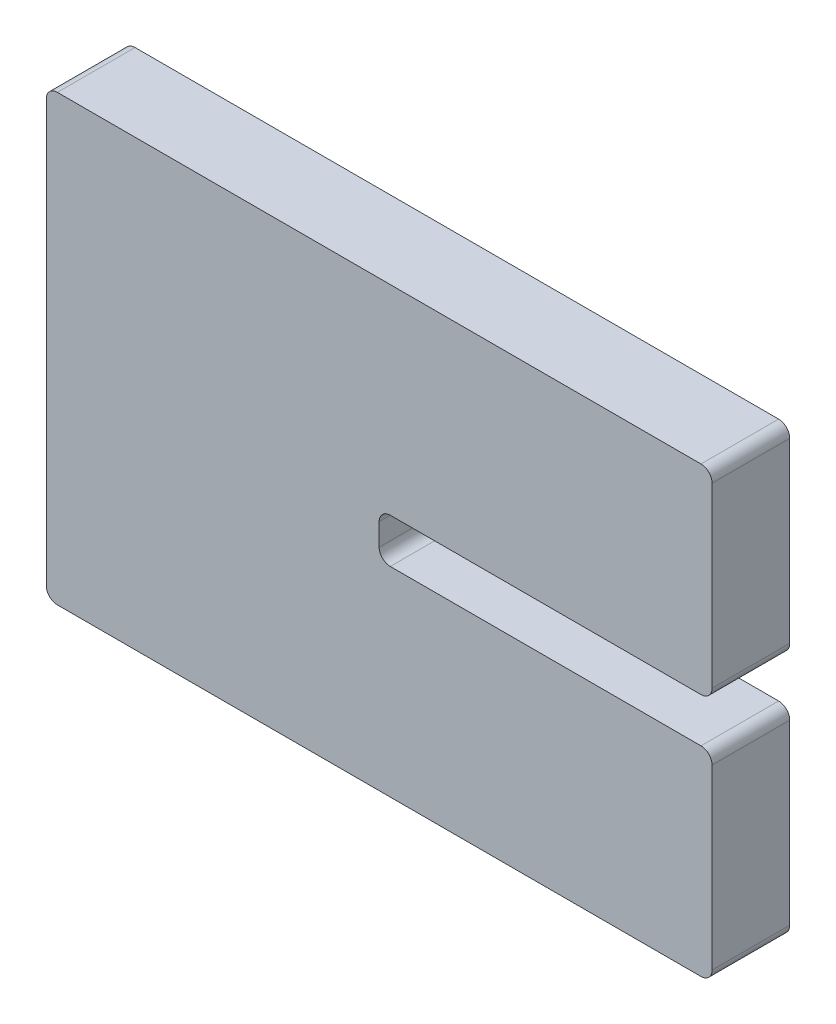
ISO-10303-21;
HEADER;
FILE_DESCRIPTION(('STEP AP214'),'2;1');
FILE_NAME('part.step','',(''),(''),'','','');
FILE_SCHEMA(('AUTOMOTIVE_DESIGN { 1 0 10303 214 1 1 1 1 }'));
ENDSEC;
DATA;
#1=APPLICATION_CONTEXT('core data for automotive mechanical design processes');
#2=APPLICATION_PROTOCOL_DEFINITION('international standard','automotive_design',2000,#1);
#3=PRODUCT_CONTEXT('',#1,'mechanical');
#4=PRODUCT('Part','Part','',(#3));
#5=PRODUCT_RELATED_PRODUCT_CATEGORY('part','',(#4));
#6=PRODUCT_DEFINITION_FORMATION('','',#4);
#7=PRODUCT_DEFINITION_CONTEXT('part definition',#1,'design');
#8=PRODUCT_DEFINITION('design','',#6,#7);
#9=PRODUCT_DEFINITION_SHAPE('','',#8);
#10=(LENGTH_UNIT() NAMED_UNIT(*) SI_UNIT(.MILLI.,.METRE.));
#11=(NAMED_UNIT(*) PLANE_ANGLE_UNIT() SI_UNIT($,.RADIAN.));
#12=(NAMED_UNIT(*) SI_UNIT($,.STERADIAN.) SOLID_ANGLE_UNIT());
#13=UNCERTAINTY_MEASURE_WITH_UNIT(LENGTH_MEASURE(1.E-05),#10,'distance_accuracy_value','');
#14=(GEOMETRIC_REPRESENTATION_CONTEXT(3) GLOBAL_UNCERTAINTY_ASSIGNED_CONTEXT((#13)) GLOBAL_UNIT_ASSIGNED_CONTEXT((#10,
#11,#12)) REPRESENTATION_CONTEXT('',''));
#15=CARTESIAN_POINT('',(0.,0.,0.));
#16=DIRECTION('',(0.,0.,1.));
#17=DIRECTION('',(1.,0.,0.));
#18=AXIS2_PLACEMENT_3D('',#15,#16,#17);
#19=CARTESIAN_POINT('',(-15.,-10.,3.5));
#20=DIRECTION('',(0.,1.,0.));
#21=DIRECTION('',(0.,0.,1.));
#22=AXIS2_PLACEMENT_3D('',#19,#20,#21);
#23=PLANE('',#22);
#24=DIRECTION('',(1.,0.,0.));
#25=VECTOR('',#24,1.);
#26=CARTESIAN_POINT('',(-15.,-10.,0.));
#27=LINE('',#26,#25);
#28=CARTESIAN_POINT('',(-14.5,-10.,0.));
#29=VERTEX_POINT('',#28);
#30=CARTESIAN_POINT('',(14.5,-10.,0.));
#31=VERTEX_POINT('',#30);
#32=EDGE_CURVE('E272',#29,#31,#27,.T.);
#33=ORIENTED_EDGE('',*,*,#32,.T.);
#34=DIRECTION('',(0.,0.,-1.));
#35=VECTOR('',#34,1.);
#36=CARTESIAN_POINT('',(14.5,-10.,3.5));
#37=LINE('',#36,#35);
#38=CARTESIAN_POINT('',(14.5,-10.,3.5));
#39=VERTEX_POINT('',#38);
#40=EDGE_CURVE('E242',#31,#39,#37,.F.);
#41=ORIENTED_EDGE('',*,*,#40,.T.);
#42=DIRECTION('',(1.,0.,0.));
#43=VECTOR('',#42,1.);
#44=CARTESIAN_POINT('',(-15.,-10.,3.5));
#45=LINE('',#44,#43);
#46=CARTESIAN_POINT('',(-14.5,-10.,3.5));
#47=VERTEX_POINT('',#46);
#48=EDGE_CURVE('E190',#47,#39,#45,.T.);
#49=ORIENTED_EDGE('',*,*,#48,.F.);
#50=DIRECTION('',(0.,0.,-1.));
#51=VECTOR('',#50,1.);
#52=CARTESIAN_POINT('',(-14.5,-10.,3.5));
#53=LINE('',#52,#51);
#54=EDGE_CURVE('E239',#47,#29,#53,.T.);
#55=ORIENTED_EDGE('',*,*,#54,.T.);
#56=EDGE_LOOP('',(#33,#41,#49,#55));
#57=FACE_BOUND('',#56,.T.);
#58=ADVANCED_FACE('F33',(#57),#23,.F.);
#59=CARTESIAN_POINT('',(15.,-1.,3.5));
#60=DIRECTION('',(-1.,0.,0.));
#61=DIRECTION('',(0.,0.,1.));
#62=AXIS2_PLACEMENT_3D('',#59,#60,#61);
#63=PLANE('',#62);
#64=DIRECTION('',(0.,1.,0.));
#65=VECTOR('',#64,1.);
#66=CARTESIAN_POINT('',(15.,-1.,0.));
#67=LINE('',#66,#65);
#68=CARTESIAN_POINT('',(15.,-9.5,0.));
#69=VERTEX_POINT('',#68);
#70=CARTESIAN_POINT('',(15.,-1.5,0.));
#71=VERTEX_POINT('',#70);
#72=EDGE_CURVE('E179',#69,#71,#67,.T.);
#73=ORIENTED_EDGE('',*,*,#72,.T.);
#74=DIRECTION('',(0.,0.,-1.));
#75=VECTOR('',#74,1.);
#76=CARTESIAN_POINT('',(15.,-1.5,3.5));
#77=LINE('',#76,#75);
#78=CARTESIAN_POINT('',(15.,-1.5,3.5));
#79=VERTEX_POINT('',#78);
#80=EDGE_CURVE('E237',#71,#79,#77,.F.);
#81=ORIENTED_EDGE('',*,*,#80,.T.);
#82=DIRECTION('',(0.,1.,0.));
#83=VECTOR('',#82,1.);
#84=CARTESIAN_POINT('',(15.,-1.,3.5));
#85=LINE('',#84,#83);
#86=CARTESIAN_POINT('',(15.,-9.5,3.5));
#87=VERTEX_POINT('',#86);
#88=EDGE_CURVE('E258',#87,#79,#85,.T.);
#89=ORIENTED_EDGE('',*,*,#88,.F.);
#90=DIRECTION('',(0.,0.,-1.));
#91=VECTOR('',#90,1.);
#92=CARTESIAN_POINT('',(15.,-9.5,3.5));
#93=LINE('',#92,#91);
#94=EDGE_CURVE('E234',#87,#69,#93,.T.);
#95=ORIENTED_EDGE('',*,*,#94,.T.);
#96=EDGE_LOOP('',(#73,#81,#89,#95));
#97=FACE_BOUND('',#96,.T.);
#98=ADVANCED_FACE('F278',(#97),#63,.F.);
#99=CARTESIAN_POINT('',(0.,-1.,3.5));
#100=DIRECTION('',(0.,-1.,0.));
#101=DIRECTION('',(0.,0.,-1.));
#102=AXIS2_PLACEMENT_3D('',#99,#100,#101);
#103=PLANE('',#102);
#104=DIRECTION('',(-1.,0.,0.));
#105=VECTOR('',#104,1.);
#106=CARTESIAN_POINT('',(0.,-1.,0.));
#107=LINE('',#106,#105);
#108=CARTESIAN_POINT('',(14.5,-1.,0.));
#109=VERTEX_POINT('',#108);
#110=CARTESIAN_POINT('',(0.5,-1.,0.));
#111=VERTEX_POINT('',#110);
#112=EDGE_CURVE('E174',#109,#111,#107,.T.);
#113=ORIENTED_EDGE('',*,*,#112,.T.);
#114=DIRECTION('',(0.,0.,-1.));
#115=VECTOR('',#114,1.);
#116=CARTESIAN_POINT('',(0.5,-1.,3.5));
#117=LINE('',#116,#115);
#118=CARTESIAN_POINT('',(0.5,-1.,3.5));
#119=VERTEX_POINT('',#118);
#120=EDGE_CURVE('E152',#111,#119,#117,.F.);
#121=ORIENTED_EDGE('',*,*,#120,.T.);
#122=DIRECTION('',(-1.,0.,0.));
#123=VECTOR('',#122,1.);
#124=CARTESIAN_POINT('',(0.,-1.,3.5));
#125=LINE('',#124,#123);
#126=CARTESIAN_POINT('',(14.5,-1.,3.5));
#127=VERTEX_POINT('',#126);
#128=EDGE_CURVE('E253',#127,#119,#125,.T.);
#129=ORIENTED_EDGE('',*,*,#128,.F.);
#130=DIRECTION('',(0.,0.,-1.));
#131=VECTOR('',#130,1.);
#132=CARTESIAN_POINT('',(14.5,-1.,3.5));
#133=LINE('',#132,#131);
#134=EDGE_CURVE('E167',#127,#109,#133,.T.);
#135=ORIENTED_EDGE('',*,*,#134,.T.);
#136=EDGE_LOOP('',(#113,#121,#129,#135));
#137=FACE_BOUND('',#136,.T.);
#138=ADVANCED_FACE('F283',(#137),#103,.F.);
#139=CARTESIAN_POINT('',(0.,-1.,3.5));
#140=DIRECTION('',(-1.,0.,0.));
#141=DIRECTION('',(0.,-1.,0.));
#142=AXIS2_PLACEMENT_3D('',#139,#140,#141);
#143=PLANE('',#142);
#144=DIRECTION('',(0.,1.,0.));
#145=VECTOR('',#144,1.);
#146=CARTESIAN_POINT('',(0.,-1.,3.5));
#147=LINE('',#146,#145);
#148=CARTESIAN_POINT('',(0.,-0.5,3.5));
#149=VERTEX_POINT('',#148);
#150=CARTESIAN_POINT('',(0.,0.5,3.5));
#151=VERTEX_POINT('',#150);
#152=EDGE_CURVE('E166',#149,#151,#147,.T.);
#153=ORIENTED_EDGE('',*,*,#152,.F.);
#154=DIRECTION('',(0.,0.,-1.));
#155=VECTOR('',#154,1.);
#156=CARTESIAN_POINT('',(0.,-0.5,0.));
#157=LINE('',#156,#155);
#158=CARTESIAN_POINT('',(0.,-0.5,0.));
#159=VERTEX_POINT('',#158);
#160=EDGE_CURVE('E151',#149,#159,#157,.T.);
#161=ORIENTED_EDGE('',*,*,#160,.T.);
#162=DIRECTION('',(0.,1.,0.));
#163=VECTOR('',#162,1.);
#164=CARTESIAN_POINT('',(0.,-1.,0.));
#165=LINE('',#164,#163);
#166=CARTESIAN_POINT('',(0.,0.5,0.));
#167=VERTEX_POINT('',#166);
#168=EDGE_CURVE('E163',#159,#167,#165,.T.);
#169=ORIENTED_EDGE('',*,*,#168,.T.);
#170=DIRECTION('',(0.,0.,-1.));
#171=VECTOR('',#170,1.);
#172=CARTESIAN_POINT('',(0.,0.5,3.5));
#173=LINE('',#172,#171);
#174=EDGE_CURVE('E168',#167,#151,#173,.F.);
#175=ORIENTED_EDGE('',*,*,#174,.T.);
#176=EDGE_LOOP('',(#153,#161,#169,#175));
#177=FACE_BOUND('',#176,.T.);
#178=ADVANCED_FACE('F162',(#177),#143,.F.);
#179=CARTESIAN_POINT('',(0.,1.,3.5));
#180=DIRECTION('',(0.,1.,0.));
#181=DIRECTION('',(-1.,0.,0.));
#182=AXIS2_PLACEMENT_3D('',#179,#180,#181);
#183=PLANE('',#182);
#184=DIRECTION('',(1.,0.,0.));
#185=VECTOR('',#184,1.);
#186=CARTESIAN_POINT('',(0.,1.,3.5));
#187=LINE('',#186,#185);
#188=CARTESIAN_POINT('',(0.499999999999999,1.,3.5));
#189=VERTEX_POINT('',#188);
#190=CARTESIAN_POINT('',(14.5,1.00000000000001,3.5));
#191=VERTEX_POINT('',#190);
#192=EDGE_CURVE('E260',#189,#191,#187,.T.);
#193=ORIENTED_EDGE('',*,*,#192,.F.);
#194=DIRECTION('',(0.,0.,-1.));
#195=VECTOR('',#194,1.);
#196=CARTESIAN_POINT('',(0.499999999999999,1.,0.));
#197=LINE('',#196,#195);
#198=CARTESIAN_POINT('',(0.499999999999999,1.,0.));
#199=VERTEX_POINT('',#198);
#200=EDGE_CURVE('E198',#189,#199,#197,.T.);
#201=ORIENTED_EDGE('',*,*,#200,.T.);
#202=DIRECTION('',(1.,0.,0.));
#203=VECTOR('',#202,1.);
#204=CARTESIAN_POINT('',(0.,1.,0.));
#205=LINE('',#204,#203);
#206=CARTESIAN_POINT('',(14.5,1.00000000000001,0.));
#207=VERTEX_POINT('',#206);
#208=EDGE_CURVE('E173',#199,#207,#205,.T.);
#209=ORIENTED_EDGE('',*,*,#208,.T.);
#210=DIRECTION('',(0.,0.,-1.));
#211=VECTOR('',#210,1.);
#212=CARTESIAN_POINT('',(14.5,1.00000000000001,3.5));
#213=LINE('',#212,#211);
#214=EDGE_CURVE('E196',#207,#191,#213,.F.);
#215=ORIENTED_EDGE('',*,*,#214,.T.);
#216=EDGE_LOOP('',(#193,#201,#209,#215));
#217=FACE_BOUND('',#216,.T.);
#218=ADVANCED_FACE('F290',(#217),#183,.F.);
#219=CARTESIAN_POINT('',(15.,10.,3.5));
#220=DIRECTION('',(-1.,0.,0.));
#221=DIRECTION('',(0.,-1.,0.));
#222=AXIS2_PLACEMENT_3D('',#219,#220,#221);
#223=PLANE('',#222);
#224=DIRECTION('',(0.,1.,0.));
#225=VECTOR('',#224,1.);
#226=CARTESIAN_POINT('',(15.,10.,0.));
#227=LINE('',#226,#225);
#228=CARTESIAN_POINT('',(15.,1.5,0.));
#229=VERTEX_POINT('',#228);
#230=CARTESIAN_POINT('',(15.,9.5,0.));
#231=VERTEX_POINT('',#230);
#232=EDGE_CURVE('E177',#229,#231,#227,.T.);
#233=ORIENTED_EDGE('',*,*,#232,.T.);
#234=DIRECTION('',(0.,0.,-1.));
#235=VECTOR('',#234,1.);
#236=CARTESIAN_POINT('',(15.,9.5,3.5));
#237=LINE('',#236,#235);
#238=CARTESIAN_POINT('',(15.,9.5,3.5));
#239=VERTEX_POINT('',#238);
#240=EDGE_CURVE('E221',#231,#239,#237,.F.);
#241=ORIENTED_EDGE('',*,*,#240,.T.);
#242=DIRECTION('',(0.,1.,0.));
#243=VECTOR('',#242,1.);
#244=CARTESIAN_POINT('',(15.,10.,3.5));
#245=LINE('',#244,#243);
#246=CARTESIAN_POINT('',(15.,1.5,3.5));
#247=VERTEX_POINT('',#246);
#248=EDGE_CURVE('E267',#247,#239,#245,.T.);
#249=ORIENTED_EDGE('',*,*,#248,.F.);
#250=DIRECTION('',(0.,0.,-1.));
#251=VECTOR('',#250,1.);
#252=CARTESIAN_POINT('',(15.,1.5,3.5));
#253=LINE('',#252,#251);
#254=EDGE_CURVE('E218',#247,#229,#253,.T.);
#255=ORIENTED_EDGE('',*,*,#254,.T.);
#256=EDGE_LOOP('',(#233,#241,#249,#255));
#257=FACE_BOUND('',#256,.T.);
#258=ADVANCED_FACE('F344',(#257),#223,.F.);
#259=CARTESIAN_POINT('',(-15.,10.,3.5));
#260=DIRECTION('',(0.,-1.,0.));
#261=DIRECTION('',(0.,0.,-1.));
#262=AXIS2_PLACEMENT_3D('',#259,#260,#261);
#263=PLANE('',#262);
#264=DIRECTION('',(-1.,0.,0.));
#265=VECTOR('',#264,1.);
#266=CARTESIAN_POINT('',(-15.,10.,3.5));
#267=LINE('',#266,#265);
#268=CARTESIAN_POINT('',(14.5,10.,3.5));
#269=VERTEX_POINT('',#268);
#270=CARTESIAN_POINT('',(-14.5,10.,3.5));
#271=VERTEX_POINT('',#270);
#272=EDGE_CURVE('E269',#269,#271,#267,.T.);
#273=ORIENTED_EDGE('',*,*,#272,.F.);
#274=DIRECTION('',(0.,0.,-1.));
#275=VECTOR('',#274,1.);
#276=CARTESIAN_POINT('',(14.5,10.,3.5));
#277=LINE('',#276,#275);
#278=CARTESIAN_POINT('',(14.5,10.,0.));
#279=VERTEX_POINT('',#278);
#280=EDGE_CURVE('E203',#269,#279,#277,.T.);
#281=ORIENTED_EDGE('',*,*,#280,.T.);
#282=DIRECTION('',(-1.,0.,0.));
#283=VECTOR('',#282,1.);
#284=CARTESIAN_POINT('',(-15.,10.,0.));
#285=LINE('',#284,#283);
#286=CARTESIAN_POINT('',(-14.5,10.,0.));
#287=VERTEX_POINT('',#286);
#288=EDGE_CURVE('E185',#279,#287,#285,.T.);
#289=ORIENTED_EDGE('',*,*,#288,.T.);
#290=DIRECTION('',(0.,0.,-1.));
#291=VECTOR('',#290,1.);
#292=CARTESIAN_POINT('',(-14.5,10.,3.5));
#293=LINE('',#292,#291);
#294=EDGE_CURVE('E201',#287,#271,#293,.F.);
#295=ORIENTED_EDGE('',*,*,#294,.T.);
#296=EDGE_LOOP('',(#273,#281,#289,#295));
#297=FACE_BOUND('',#296,.T.);
#298=ADVANCED_FACE('F338',(#297),#263,.F.);
#299=CARTESIAN_POINT('',(-15.,10.,3.5));
#300=DIRECTION('',(1.,0.,0.));
#301=DIRECTION('',(0.,1.,0.));
#302=AXIS2_PLACEMENT_3D('',#299,#300,#301);
#303=PLANE('',#302);
#304=DIRECTION('',(0.,-1.,0.));
#305=VECTOR('',#304,1.);
#306=CARTESIAN_POINT('',(-15.,10.,0.));
#307=LINE('',#306,#305);
#308=CARTESIAN_POINT('',(-15.,9.5,0.));
#309=VERTEX_POINT('',#308);
#310=CARTESIAN_POINT('',(-15.,-9.5,0.));
#311=VERTEX_POINT('',#310);
#312=EDGE_CURVE('E188',#309,#311,#307,.T.);
#313=ORIENTED_EDGE('',*,*,#312,.T.);
#314=DIRECTION('',(0.,0.,-1.));
#315=VECTOR('',#314,1.);
#316=CARTESIAN_POINT('',(-15.,-9.5,3.5));
#317=LINE('',#316,#315);
#318=CARTESIAN_POINT('',(-15.,-9.5,3.5));
#319=VERTEX_POINT('',#318);
#320=EDGE_CURVE('E48',#311,#319,#317,.F.);
#321=ORIENTED_EDGE('',*,*,#320,.T.);
#322=DIRECTION('',(0.,-1.,0.));
#323=VECTOR('',#322,1.);
#324=CARTESIAN_POINT('',(-15.,10.,3.5));
#325=LINE('',#324,#323);
#326=CARTESIAN_POINT('',(-15.,9.5,3.5));
#327=VERTEX_POINT('',#326);
#328=EDGE_CURVE('E191',#327,#319,#325,.T.);
#329=ORIENTED_EDGE('',*,*,#328,.F.);
#330=DIRECTION('',(0.,0.,-1.));
#331=VECTOR('',#330,1.);
#332=CARTESIAN_POINT('',(-15.,9.5,3.5));
#333=LINE('',#332,#331);
#334=EDGE_CURVE('E244',#327,#309,#333,.T.);
#335=ORIENTED_EDGE('',*,*,#334,.T.);
#336=EDGE_LOOP('',(#313,#321,#329,#335));
#337=FACE_BOUND('',#336,.T.);
#338=ADVANCED_FACE('F333',(#337),#303,.F.);
#339=CARTESIAN_POINT('',(0.,0.,3.5));
#340=DIRECTION('',(0.,0.,-1.));
#341=DIRECTION('',(-1.,0.,0.));
#342=AXIS2_PLACEMENT_3D('',#339,#340,#341);
#343=PLANE('',#342);
#344=ORIENTED_EDGE('',*,*,#248,.T.);
#345=CARTESIAN_POINT('',(14.5,9.5,3.5));
#346=DIRECTION('',(0.,0.,-1.));
#347=DIRECTION('',(-1.,0.,0.));
#348=AXIS2_PLACEMENT_3D('',#345,#346,#347);
#349=CIRCLE('',#348,0.5);
#350=EDGE_CURVE('E232',#239,#269,#349,.F.);
#351=ORIENTED_EDGE('',*,*,#350,.T.);
#352=ORIENTED_EDGE('',*,*,#272,.T.);
#353=CARTESIAN_POINT('',(-14.5,9.5,3.5));
#354=DIRECTION('',(0.,0.,-1.));
#355=DIRECTION('',(-1.,0.,0.));
#356=AXIS2_PLACEMENT_3D('',#353,#354,#355);
#357=CIRCLE('',#356,0.5);
#358=EDGE_CURVE('E55',#271,#327,#357,.F.);
#359=ORIENTED_EDGE('',*,*,#358,.T.);
#360=ORIENTED_EDGE('',*,*,#328,.T.);
#361=CARTESIAN_POINT('',(-14.5,-9.5,3.5));
#362=DIRECTION('',(0.,0.,-1.));
#363=DIRECTION('',(-1.,0.,0.));
#364=AXIS2_PLACEMENT_3D('',#361,#362,#363);
#365=CIRCLE('',#364,0.5);
#366=EDGE_CURVE('E224',#319,#47,#365,.F.);
#367=ORIENTED_EDGE('',*,*,#366,.T.);
#368=ORIENTED_EDGE('',*,*,#48,.T.);
#369=CARTESIAN_POINT('',(14.5,-9.5,3.5));
#370=DIRECTION('',(0.,0.,-1.));
#371=DIRECTION('',(-1.,0.,0.));
#372=AXIS2_PLACEMENT_3D('',#369,#370,#371);
#373=CIRCLE('',#372,0.5);
#374=EDGE_CURVE('E226',#39,#87,#373,.F.);
#375=ORIENTED_EDGE('',*,*,#374,.T.);
#376=ORIENTED_EDGE('',*,*,#88,.T.);
#377=CARTESIAN_POINT('',(14.5,-1.5,3.5));
#378=DIRECTION('',(0.,0.,-1.));
#379=DIRECTION('',(-1.,0.,0.));
#380=AXIS2_PLACEMENT_3D('',#377,#378,#379);
#381=CIRCLE('',#380,0.5);
#382=EDGE_CURVE('E230',#79,#127,#381,.F.);
#383=ORIENTED_EDGE('',*,*,#382,.T.);
#384=ORIENTED_EDGE('',*,*,#128,.T.);
#385=CARTESIAN_POINT('',(0.5,-0.5,3.5));
#386=DIRECTION('',(0.,0.,-1.));
#387=DIRECTION('',(-1.,0.,0.));
#388=AXIS2_PLACEMENT_3D('',#385,#386,#387);
#389=CIRCLE('',#388,0.5);
#390=EDGE_CURVE('E157',#119,#149,#389,.T.);
#391=ORIENTED_EDGE('',*,*,#390,.T.);
#392=ORIENTED_EDGE('',*,*,#152,.T.);
#393=CARTESIAN_POINT('',(0.5,0.5,3.5));
#394=DIRECTION('',(0.,0.,-1.));
#395=DIRECTION('',(-1.,0.,0.));
#396=AXIS2_PLACEMENT_3D('',#393,#394,#395);
#397=CIRCLE('',#396,0.5);
#398=EDGE_CURVE('E11',#151,#189,#397,.T.);
#399=ORIENTED_EDGE('',*,*,#398,.T.);
#400=ORIENTED_EDGE('',*,*,#192,.T.);
#401=CARTESIAN_POINT('',(14.5,1.5,3.5));
#402=DIRECTION('',(0.,0.,-1.));
#403=DIRECTION('',(-1.,0.,0.));
#404=AXIS2_PLACEMENT_3D('',#401,#402,#403);
#405=CIRCLE('',#404,0.5);
#406=EDGE_CURVE('E228',#191,#247,#405,.F.);
#407=ORIENTED_EDGE('',*,*,#406,.T.);
#408=EDGE_LOOP('',(#344,#351,#352,#359,#360,#367,#368,#375,#376,#383,#384,#391,#392,#399,#400,#407));
#409=FACE_BOUND('',#408,.T.);
#410=ADVANCED_FACE('F250',(#409),#343,.F.);
#411=CARTESIAN_POINT('',(0.,0.,0.));
#412=DIRECTION('',(0.,0.,-1.));
#413=DIRECTION('',(-1.,0.,0.));
#414=AXIS2_PLACEMENT_3D('',#411,#412,#413);
#415=PLANE('',#414);
#416=ORIENTED_EDGE('',*,*,#288,.F.);
#417=CARTESIAN_POINT('',(14.5,9.5,0.));
#418=DIRECTION('',(0.,0.,-1.));
#419=DIRECTION('',(-1.,0.,0.));
#420=AXIS2_PLACEMENT_3D('',#417,#418,#419);
#421=CIRCLE('',#420,0.5);
#422=EDGE_CURVE('E216',#279,#231,#421,.T.);
#423=ORIENTED_EDGE('',*,*,#422,.T.);
#424=ORIENTED_EDGE('',*,*,#232,.F.);
#425=CARTESIAN_POINT('',(14.5,1.5,0.));
#426=DIRECTION('',(0.,0.,-1.));
#427=DIRECTION('',(-1.,0.,0.));
#428=AXIS2_PLACEMENT_3D('',#425,#426,#427);
#429=CIRCLE('',#428,0.5);
#430=EDGE_CURVE('E212',#229,#207,#429,.T.);
#431=ORIENTED_EDGE('',*,*,#430,.T.);
#432=ORIENTED_EDGE('',*,*,#208,.F.);
#433=CARTESIAN_POINT('',(0.5,0.5,0.));
#434=DIRECTION('',(0.,0.,-1.));
#435=DIRECTION('',(-1.,0.,0.));
#436=AXIS2_PLACEMENT_3D('',#433,#434,#435);
#437=CIRCLE('',#436,0.5);
#438=EDGE_CURVE('E41',#199,#167,#437,.F.);
#439=ORIENTED_EDGE('',*,*,#438,.T.);
#440=ORIENTED_EDGE('',*,*,#168,.F.);
#441=CARTESIAN_POINT('',(0.5,-0.5,0.));
#442=DIRECTION('',(0.,0.,-1.));
#443=DIRECTION('',(-1.,0.,0.));
#444=AXIS2_PLACEMENT_3D('',#441,#442,#443);
#445=CIRCLE('',#444,0.5);
#446=EDGE_CURVE('E147',#159,#111,#445,.F.);
#447=ORIENTED_EDGE('',*,*,#446,.T.);
#448=ORIENTED_EDGE('',*,*,#112,.F.);
#449=CARTESIAN_POINT('',(14.5,-1.5,0.));
#450=DIRECTION('',(0.,0.,-1.));
#451=DIRECTION('',(-1.,0.,0.));
#452=AXIS2_PLACEMENT_3D('',#449,#450,#451);
#453=CIRCLE('',#452,0.5);
#454=EDGE_CURVE('E214',#109,#71,#453,.T.);
#455=ORIENTED_EDGE('',*,*,#454,.T.);
#456=ORIENTED_EDGE('',*,*,#72,.F.);
#457=CARTESIAN_POINT('',(14.5,-9.5,0.));
#458=DIRECTION('',(0.,0.,-1.));
#459=DIRECTION('',(-1.,0.,0.));
#460=AXIS2_PLACEMENT_3D('',#457,#458,#459);
#461=CIRCLE('',#460,0.5);
#462=EDGE_CURVE('E210',#69,#31,#461,.T.);
#463=ORIENTED_EDGE('',*,*,#462,.T.);
#464=ORIENTED_EDGE('',*,*,#32,.F.);
#465=CARTESIAN_POINT('',(-14.5,-9.5,0.));
#466=DIRECTION('',(0.,0.,-1.));
#467=DIRECTION('',(-1.,0.,0.));
#468=AXIS2_PLACEMENT_3D('',#465,#466,#467);
#469=CIRCLE('',#468,0.5);
#470=EDGE_CURVE('E208',#29,#311,#469,.T.);
#471=ORIENTED_EDGE('',*,*,#470,.T.);
#472=ORIENTED_EDGE('',*,*,#312,.F.);
#473=CARTESIAN_POINT('',(-14.5,9.5,0.));
#474=DIRECTION('',(0.,0.,-1.));
#475=DIRECTION('',(-1.,0.,0.));
#476=AXIS2_PLACEMENT_3D('',#473,#474,#475);
#477=CIRCLE('',#476,0.5);
#478=EDGE_CURVE('E206',#309,#287,#477,.T.);
#479=ORIENTED_EDGE('',*,*,#478,.T.);
#480=EDGE_LOOP('',(#416,#423,#424,#431,#432,#439,#440,#447,#448,#455,#456,#463,#464,#471,#472,#479));
#481=FACE_BOUND('',#480,.T.);
#482=ADVANCED_FACE('F171',(#481),#415,.T.);
#483=CARTESIAN_POINT('',(0.5,-0.5,3.5));
#484=DIRECTION('',(0.,0.,1.));
#485=DIRECTION('',(1.,0.,0.));
#486=AXIS2_PLACEMENT_3D('',#483,#484,#485);
#487=CYLINDRICAL_SURFACE('',#486,0.5);
#488=ORIENTED_EDGE('',*,*,#390,.F.);
#489=ORIENTED_EDGE('',*,*,#120,.F.);
#490=ORIENTED_EDGE('',*,*,#446,.F.);
#491=ORIENTED_EDGE('',*,*,#160,.F.);
#492=EDGE_LOOP('',(#488,#489,#490,#491));
#493=FACE_BOUND('',#492,.T.);
#494=ADVANCED_FACE('F150',(#493),#487,.F.);
#495=CARTESIAN_POINT('',(0.5,0.5,3.5));
#496=DIRECTION('',(0.,0.,1.));
#497=DIRECTION('',(1.,0.,0.));
#498=AXIS2_PLACEMENT_3D('',#495,#496,#497);
#499=CYLINDRICAL_SURFACE('',#498,0.5);
#500=ORIENTED_EDGE('',*,*,#398,.F.);
#501=ORIENTED_EDGE('',*,*,#174,.F.);
#502=ORIENTED_EDGE('',*,*,#438,.F.);
#503=ORIENTED_EDGE('',*,*,#200,.F.);
#504=EDGE_LOOP('',(#500,#501,#502,#503));
#505=FACE_BOUND('',#504,.T.);
#506=ADVANCED_FACE('F301',(#505),#499,.F.);
#507=CARTESIAN_POINT('',(14.5,9.5,3.5));
#508=DIRECTION('',(0.,0.,-1.));
#509=DIRECTION('',(-1.,0.,0.));
#510=AXIS2_PLACEMENT_3D('',#507,#508,#509);
#511=CYLINDRICAL_SURFACE('',#510,0.5);
#512=ORIENTED_EDGE('',*,*,#350,.F.);
#513=ORIENTED_EDGE('',*,*,#240,.F.);
#514=ORIENTED_EDGE('',*,*,#422,.F.);
#515=ORIENTED_EDGE('',*,*,#280,.F.);
#516=EDGE_LOOP('',(#512,#513,#514,#515));
#517=FACE_BOUND('',#516,.T.);
#518=ADVANCED_FACE('F304',(#517),#511,.T.);
#519=CARTESIAN_POINT('',(14.5,-1.5,3.5));
#520=DIRECTION('',(0.,0.,-1.));
#521=DIRECTION('',(-1.,0.,0.));
#522=AXIS2_PLACEMENT_3D('',#519,#520,#521);
#523=CYLINDRICAL_SURFACE('',#522,0.5);
#524=ORIENTED_EDGE('',*,*,#382,.F.);
#525=ORIENTED_EDGE('',*,*,#80,.F.);
#526=ORIENTED_EDGE('',*,*,#454,.F.);
#527=ORIENTED_EDGE('',*,*,#134,.F.);
#528=EDGE_LOOP('',(#524,#525,#526,#527));
#529=FACE_BOUND('',#528,.T.);
#530=ADVANCED_FACE('F282',(#529),#523,.T.);
#531=CARTESIAN_POINT('',(14.5,1.5,3.5));
#532=DIRECTION('',(0.,0.,-1.));
#533=DIRECTION('',(-1.,0.,0.));
#534=AXIS2_PLACEMENT_3D('',#531,#532,#533);
#535=CYLINDRICAL_SURFACE('',#534,0.5);
#536=ORIENTED_EDGE('',*,*,#406,.F.);
#537=ORIENTED_EDGE('',*,*,#214,.F.);
#538=ORIENTED_EDGE('',*,*,#430,.F.);
#539=ORIENTED_EDGE('',*,*,#254,.F.);
#540=EDGE_LOOP('',(#536,#537,#538,#539));
#541=FACE_BOUND('',#540,.T.);
#542=ADVANCED_FACE('F311',(#541),#535,.T.);
#543=CARTESIAN_POINT('',(14.5,-9.5,3.5));
#544=DIRECTION('',(0.,0.,-1.));
#545=DIRECTION('',(-1.,0.,0.));
#546=AXIS2_PLACEMENT_3D('',#543,#544,#545);
#547=CYLINDRICAL_SURFACE('',#546,0.5);
#548=ORIENTED_EDGE('',*,*,#374,.F.);
#549=ORIENTED_EDGE('',*,*,#40,.F.);
#550=ORIENTED_EDGE('',*,*,#462,.F.);
#551=ORIENTED_EDGE('',*,*,#94,.F.);
#552=EDGE_LOOP('',(#548,#549,#550,#551));
#553=FACE_BOUND('',#552,.T.);
#554=ADVANCED_FACE('F314',(#553),#547,.T.);
#555=CARTESIAN_POINT('',(-14.5,-9.5,3.5));
#556=DIRECTION('',(0.,0.,-1.));
#557=DIRECTION('',(-1.,0.,0.));
#558=AXIS2_PLACEMENT_3D('',#555,#556,#557);
#559=CYLINDRICAL_SURFACE('',#558,0.5);
#560=ORIENTED_EDGE('',*,*,#366,.F.);
#561=ORIENTED_EDGE('',*,*,#320,.F.);
#562=ORIENTED_EDGE('',*,*,#470,.F.);
#563=ORIENTED_EDGE('',*,*,#54,.F.);
#564=EDGE_LOOP('',(#560,#561,#562,#563));
#565=FACE_BOUND('',#564,.T.);
#566=ADVANCED_FACE('F317',(#565),#559,.T.);
#567=CARTESIAN_POINT('',(-14.5,9.5,3.5));
#568=DIRECTION('',(0.,0.,-1.));
#569=DIRECTION('',(-1.,0.,0.));
#570=AXIS2_PLACEMENT_3D('',#567,#568,#569);
#571=CYLINDRICAL_SURFACE('',#570,0.5);
#572=ORIENTED_EDGE('',*,*,#358,.F.);
#573=ORIENTED_EDGE('',*,*,#294,.F.);
#574=ORIENTED_EDGE('',*,*,#478,.F.);
#575=ORIENTED_EDGE('',*,*,#334,.F.);
#576=EDGE_LOOP('',(#572,#573,#574,#575));
#577=FACE_BOUND('',#576,.T.);
#578=ADVANCED_FACE('F35',(#577),#571,.T.);
#579=CLOSED_SHELL('',(#58,#98,#138,#178,#218,#258,#298,#338,#410,#482,#494,#506,#518,#530,#542,
#554,#566,#578));
#580=MANIFOLD_SOLID_BREP('B2',#579);
#581=ADVANCED_BREP_SHAPE_REPRESENTATION('',(#18,#580),#14);
#582=SHAPE_DEFINITION_REPRESENTATION(#9,#581);
ENDSEC;
END-ISO-10303-21;
